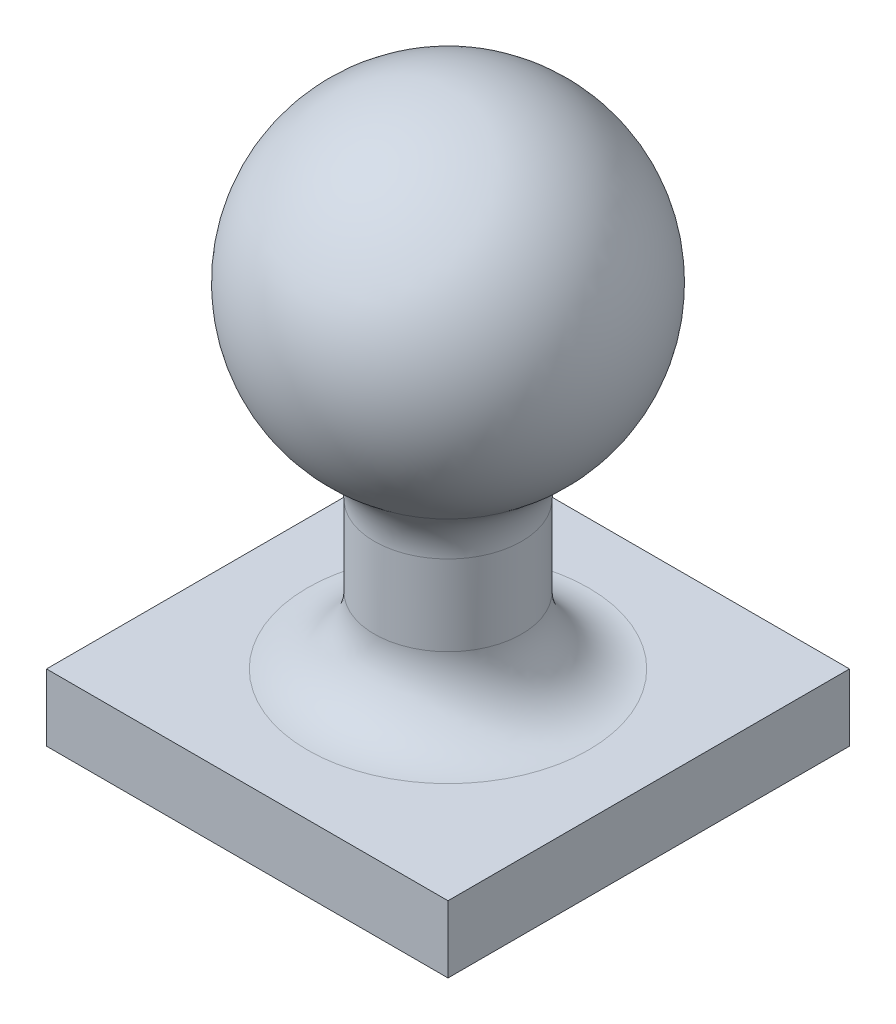
ISO-10303-21;
HEADER;
FILE_DESCRIPTION(('STEP AP214'),'2;1');
FILE_NAME('part.step','',(''),(''),'','','');
FILE_SCHEMA(('AUTOMOTIVE_DESIGN { 1 0 10303 214 1 1 1 1 }'));
ENDSEC;
DATA;
#1=APPLICATION_CONTEXT('core data for automotive mechanical design processes');
#2=APPLICATION_PROTOCOL_DEFINITION('international standard','automotive_design',2000,#1);
#3=PRODUCT_CONTEXT('',#1,'mechanical');
#4=PRODUCT('Part','Part','',(#3));
#5=PRODUCT_RELATED_PRODUCT_CATEGORY('part','',(#4));
#6=PRODUCT_DEFINITION_FORMATION('','',#4);
#7=PRODUCT_DEFINITION_CONTEXT('part definition',#1,'design');
#8=PRODUCT_DEFINITION('design','',#6,#7);
#9=PRODUCT_DEFINITION_SHAPE('','',#8);
#10=(LENGTH_UNIT() NAMED_UNIT(*) SI_UNIT(.MILLI.,.METRE.));
#11=(NAMED_UNIT(*) PLANE_ANGLE_UNIT() SI_UNIT($,.RADIAN.));
#12=(NAMED_UNIT(*) SI_UNIT($,.STERADIAN.) SOLID_ANGLE_UNIT());
#13=UNCERTAINTY_MEASURE_WITH_UNIT(LENGTH_MEASURE(1.E-05),#10,'distance_accuracy_value','');
#14=(GEOMETRIC_REPRESENTATION_CONTEXT(3) GLOBAL_UNCERTAINTY_ASSIGNED_CONTEXT((#13)) GLOBAL_UNIT_ASSIGNED_CONTEXT((#10,
#11,#12)) REPRESENTATION_CONTEXT('',''));
#15=CARTESIAN_POINT('',(0.,0.,0.));
#16=DIRECTION('',(0.,0.,1.));
#17=DIRECTION('',(1.,0.,0.));
#18=AXIS2_PLACEMENT_3D('',#15,#16,#17);
#19=CARTESIAN_POINT('',(15.24,30.48,-15.24));
#20=DIRECTION('',(0.,-1.,0.));
#21=DIRECTION('',(0.,0.,-1.));
#22=AXIS2_PLACEMENT_3D('',#19,#20,#21);
#23=CYLINDRICAL_SURFACE('',#22,5.588);
#24=CARTESIAN_POINT('',(15.24,16.256,-15.24));
#25=DIRECTION('',(0.,1.,0.));
#26=DIRECTION('',(0.,0.,1.));
#27=AXIS2_PLACEMENT_3D('',#24,#25,#26);
#28=CIRCLE('',#27,5.588);
#29=CARTESIAN_POINT('',(15.24,16.256,-9.652));
#30=VERTEX_POINT('',#29);
#31=EDGE_CURVE('E49',#30,#30,#28,.F.);
#32=ORIENTED_EDGE('',*,*,#31,.T.);
#33=EDGE_LOOP('',(#32));
#34=FACE_BOUND('',#33,.T.);
#35=CARTESIAN_POINT('',(15.24,10.16,-15.24));
#36=DIRECTION('',(0.,-1.,0.));
#37=DIRECTION('',(0.,0.,-1.));
#38=AXIS2_PLACEMENT_3D('',#35,#36,#37);
#39=CIRCLE('',#38,5.588);
#40=CARTESIAN_POINT('',(15.24,10.16,-20.828));
#41=VERTEX_POINT('',#40);
#42=EDGE_CURVE('E132',#41,#41,#39,.F.);
#43=ORIENTED_EDGE('',*,*,#42,.T.);
#44=EDGE_LOOP('',(#43));
#45=FACE_BOUND('',#44,.T.);
#46=ADVANCED_FACE('F39',(#34,#45),#23,.T.);
#47=CARTESIAN_POINT('',(0.,5.08,0.));
#48=DIRECTION('',(1.,0.,0.));
#49=DIRECTION('',(0.,0.,-1.));
#50=AXIS2_PLACEMENT_3D('',#47,#48,#49);
#51=PLANE('',#50);
#52=DIRECTION('',(0.,0.,1.));
#53=VECTOR('',#52,1.);
#54=CARTESIAN_POINT('',(0.,0.,0.));
#55=LINE('',#54,#53);
#56=CARTESIAN_POINT('',(0.,0.,-30.48));
#57=VERTEX_POINT('',#56);
#58=CARTESIAN_POINT('',(0.,0.,0.));
#59=VERTEX_POINT('',#58);
#60=EDGE_CURVE('E112',#57,#59,#55,.T.);
#61=ORIENTED_EDGE('',*,*,#60,.T.);
#62=DIRECTION('',(0.,-1.,0.));
#63=VECTOR('',#62,1.);
#64=CARTESIAN_POINT('',(0.,5.08,0.));
#65=LINE('',#64,#63);
#66=CARTESIAN_POINT('',(0.,5.08,0.));
#67=VERTEX_POINT('',#66);
#68=EDGE_CURVE('E101',#67,#59,#65,.T.);
#69=ORIENTED_EDGE('',*,*,#68,.F.);
#70=DIRECTION('',(0.,0.,1.));
#71=VECTOR('',#70,1.);
#72=CARTESIAN_POINT('',(0.,5.08,0.));
#73=LINE('',#72,#71);
#74=CARTESIAN_POINT('',(0.,5.08,-30.48));
#75=VERTEX_POINT('',#74);
#76=EDGE_CURVE('E93',#75,#67,#73,.T.);
#77=ORIENTED_EDGE('',*,*,#76,.F.);
#78=DIRECTION('',(0.,-1.,0.));
#79=VECTOR('',#78,1.);
#80=CARTESIAN_POINT('',(0.,5.08,-30.48));
#81=LINE('',#80,#79);
#82=EDGE_CURVE('E108',#75,#57,#81,.T.);
#83=ORIENTED_EDGE('',*,*,#82,.T.);
#84=EDGE_LOOP('',(#61,#69,#77,#83));
#85=FACE_BOUND('',#84,.T.);
#86=ADVANCED_FACE('F157',(#85),#51,.F.);
#87=CARTESIAN_POINT('',(0.,5.08,0.));
#88=DIRECTION('',(0.,0.,-1.));
#89=DIRECTION('',(-1.,0.,0.));
#90=AXIS2_PLACEMENT_3D('',#87,#88,#89);
#91=PLANE('',#90);
#92=DIRECTION('',(1.,0.,0.));
#93=VECTOR('',#92,1.);
#94=CARTESIAN_POINT('',(0.,0.,0.));
#95=LINE('',#94,#93);
#96=CARTESIAN_POINT('',(30.48,0.,0.));
#97=VERTEX_POINT('',#96);
#98=EDGE_CURVE('E99',#59,#97,#95,.T.);
#99=ORIENTED_EDGE('',*,*,#98,.T.);
#100=DIRECTION('',(0.,-1.,0.));
#101=VECTOR('',#100,1.);
#102=CARTESIAN_POINT('',(30.48,5.08,0.));
#103=LINE('',#102,#101);
#104=CARTESIAN_POINT('',(30.48,5.08,0.));
#105=VERTEX_POINT('',#104);
#106=EDGE_CURVE('E97',#105,#97,#103,.T.);
#107=ORIENTED_EDGE('',*,*,#106,.F.);
#108=DIRECTION('',(1.,0.,0.));
#109=VECTOR('',#108,1.);
#110=CARTESIAN_POINT('',(0.,5.08,0.));
#111=LINE('',#110,#109);
#112=EDGE_CURVE('E88',#67,#105,#111,.T.);
#113=ORIENTED_EDGE('',*,*,#112,.F.);
#114=ORIENTED_EDGE('',*,*,#68,.T.);
#115=EDGE_LOOP('',(#99,#107,#113,#114));
#116=FACE_BOUND('',#115,.T.);
#117=ADVANCED_FACE('F98',(#116),#91,.F.);
#118=CARTESIAN_POINT('',(30.48,5.08,0.));
#119=DIRECTION('',(-1.,0.,0.));
#120=DIRECTION('',(0.,0.,1.));
#121=AXIS2_PLACEMENT_3D('',#118,#119,#120);
#122=PLANE('',#121);
#123=DIRECTION('',(0.,0.,-1.));
#124=VECTOR('',#123,1.);
#125=CARTESIAN_POINT('',(30.48,0.,0.));
#126=LINE('',#125,#124);
#127=CARTESIAN_POINT('',(30.48,0.,-30.48));
#128=VERTEX_POINT('',#127);
#129=EDGE_CURVE('E74',#97,#128,#126,.T.);
#130=ORIENTED_EDGE('',*,*,#129,.T.);
#131=DIRECTION('',(0.,-1.,0.));
#132=VECTOR('',#131,1.);
#133=CARTESIAN_POINT('',(30.48,5.08,-30.48));
#134=LINE('',#133,#132);
#135=CARTESIAN_POINT('',(30.48,5.08,-30.48));
#136=VERTEX_POINT('',#135);
#137=EDGE_CURVE('E102',#136,#128,#134,.T.);
#138=ORIENTED_EDGE('',*,*,#137,.F.);
#139=DIRECTION('',(0.,0.,-1.));
#140=VECTOR('',#139,1.);
#141=CARTESIAN_POINT('',(30.48,5.08,0.));
#142=LINE('',#141,#140);
#143=EDGE_CURVE('E91',#105,#136,#142,.T.);
#144=ORIENTED_EDGE('',*,*,#143,.F.);
#145=ORIENTED_EDGE('',*,*,#106,.T.);
#146=EDGE_LOOP('',(#130,#138,#144,#145));
#147=FACE_BOUND('',#146,.T.);
#148=ADVANCED_FACE('F104',(#147),#122,.F.);
#149=CARTESIAN_POINT('',(0.,5.08,-30.48));
#150=DIRECTION('',(0.,0.,1.));
#151=DIRECTION('',(1.,0.,0.));
#152=AXIS2_PLACEMENT_3D('',#149,#150,#151);
#153=PLANE('',#152);
#154=DIRECTION('',(-1.,0.,0.));
#155=VECTOR('',#154,1.);
#156=CARTESIAN_POINT('',(0.,0.,-30.48));
#157=LINE('',#156,#155);
#158=EDGE_CURVE('E80',#128,#57,#157,.T.);
#159=ORIENTED_EDGE('',*,*,#158,.T.);
#160=ORIENTED_EDGE('',*,*,#82,.F.);
#161=DIRECTION('',(-1.,0.,0.));
#162=VECTOR('',#161,1.);
#163=CARTESIAN_POINT('',(0.,5.08,-30.48));
#164=LINE('',#163,#162);
#165=EDGE_CURVE('E57',#136,#75,#164,.T.);
#166=ORIENTED_EDGE('',*,*,#165,.F.);
#167=ORIENTED_EDGE('',*,*,#137,.T.);
#168=EDGE_LOOP('',(#159,#160,#166,#167));
#169=FACE_BOUND('',#168,.T.);
#170=ADVANCED_FACE('F165',(#169),#153,.F.);
#171=CARTESIAN_POINT('',(0.,5.08,0.));
#172=DIRECTION('',(0.,-1.,0.));
#173=DIRECTION('',(0.,0.,-1.));
#174=AXIS2_PLACEMENT_3D('',#171,#172,#173);
#175=PLANE('',#174);
#176=CARTESIAN_POINT('',(15.24,5.08,-15.24));
#177=DIRECTION('',(0.,-1.,0.));
#178=DIRECTION('',(0.,0.,-1.));
#179=AXIS2_PLACEMENT_3D('',#176,#177,#178);
#180=CIRCLE('',#179,10.668);
#181=CARTESIAN_POINT('',(15.24,5.08,-25.908));
#182=VERTEX_POINT('',#181);
#183=EDGE_CURVE('E11',#182,#182,#180,.T.);
#184=ORIENTED_EDGE('',*,*,#183,.T.);
#185=EDGE_LOOP('',(#184));
#186=FACE_BOUND('',#185,.T.);
#187=ORIENTED_EDGE('',*,*,#76,.T.);
#188=ORIENTED_EDGE('',*,*,#112,.T.);
#189=ORIENTED_EDGE('',*,*,#143,.T.);
#190=ORIENTED_EDGE('',*,*,#165,.T.);
#191=EDGE_LOOP('',(#187,#188,#189,#190));
#192=FACE_BOUND('',#191,.T.);
#193=ADVANCED_FACE('F89',(#186,#192),#175,.F.);
#194=CARTESIAN_POINT('',(0.,0.,0.));
#195=DIRECTION('',(0.,-1.,0.));
#196=DIRECTION('',(0.,0.,-1.));
#197=AXIS2_PLACEMENT_3D('',#194,#195,#196);
#198=PLANE('',#197);
#199=ORIENTED_EDGE('',*,*,#60,.F.);
#200=ORIENTED_EDGE('',*,*,#158,.F.);
#201=ORIENTED_EDGE('',*,*,#129,.F.);
#202=ORIENTED_EDGE('',*,*,#98,.F.);
#203=EDGE_LOOP('',(#199,#200,#201,#202));
#204=FACE_BOUND('',#203,.T.);
#205=ADVANCED_FACE('F148',(#204),#198,.T.);
#206=CARTESIAN_POINT('',(15.24,30.48,-15.24));
#207=DIRECTION('',(0.,0.,-1.));
#208=DIRECTION('',(-1.,0.,0.));
#209=AXIS2_PLACEMENT_3D('',#206,#207,#208);
#210=SPHERICAL_SURFACE('',#209,12.7);
#211=CARTESIAN_POINT('',(15.24,30.48,-15.24));
#212=DIRECTION('',(0.,1.,0.));
#213=DIRECTION('',(0.,0.,1.));
#214=AXIS2_PLACEMENT_3D('',#211,#212,#213);
#215=SPHERICAL_SURFACE('',#214,12.7);
#216=CARTESIAN_POINT('',(15.24,20.32,-15.24));
#217=DIRECTION('',(0.,1.,0.));
#218=DIRECTION('',(0.,0.,1.));
#219=AXIS2_PLACEMENT_3D('',#216,#217,#218);
#220=CIRCLE('',#219,7.62);
#221=CARTESIAN_POINT('',(15.24,20.32,-7.62));
#222=VERTEX_POINT('',#221);
#223=EDGE_CURVE('E128',#222,#222,#220,.T.);
#224=ORIENTED_EDGE('',*,*,#223,.T.);
#225=EDGE_LOOP('',(#224));
#226=FACE_BOUND('',#225,.T.);
#227=ADVANCED_FACE('F144',(#226),#215,.T.);
#228=CARTESIAN_POINT('',(15.24,16.256,-15.24));
#229=DIRECTION('',(0.,1.,0.));
#230=DIRECTION('',(0.,0.,1.));
#231=AXIS2_PLACEMENT_3D('',#228,#229,#230);
#232=TOROIDAL_SURFACE('',#231,10.668,5.08);
#233=ORIENTED_EDGE('',*,*,#31,.F.);
#234=EDGE_LOOP('',(#233));
#235=FACE_BOUND('',#234,.T.);
#236=ORIENTED_EDGE('',*,*,#223,.F.);
#237=EDGE_LOOP('',(#236));
#238=FACE_BOUND('',#237,.T.);
#239=ADVANCED_FACE('F141',(#235,#238),#232,.F.);
#240=CARTESIAN_POINT('',(15.24,10.16,-15.24));
#241=DIRECTION('',(0.,-1.,0.));
#242=DIRECTION('',(0.,0.,-1.));
#243=AXIS2_PLACEMENT_3D('',#240,#241,#242);
#244=TOROIDAL_SURFACE('',#243,10.668,5.08);
#245=ORIENTED_EDGE('',*,*,#183,.F.);
#246=EDGE_LOOP('',(#245));
#247=FACE_BOUND('',#246,.T.);
#248=ORIENTED_EDGE('',*,*,#42,.F.);
#249=EDGE_LOOP('',(#248));
#250=FACE_BOUND('',#249,.T.);
#251=ADVANCED_FACE('F41',(#247,#250),#244,.F.);
#252=CLOSED_SHELL('',(#46,#86,#117,#148,#170,#193,#205,#227,#239,#251));
#253=MANIFOLD_SOLID_BREP('B2',#252);
#254=ADVANCED_BREP_SHAPE_REPRESENTATION('',(#18,#253),#14);
#255=SHAPE_DEFINITION_REPRESENTATION(#9,#254);
ENDSEC;
END-ISO-10303-21;
